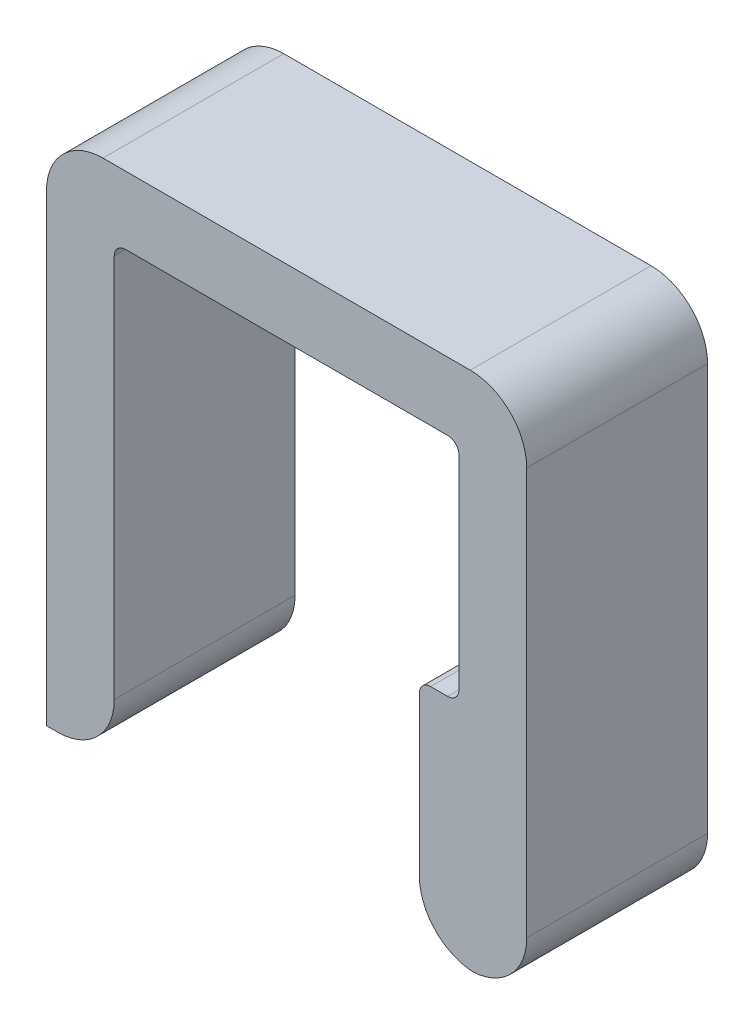
ISO-10303-21;
HEADER;
FILE_DESCRIPTION(('STEP AP214'),'2;1');
FILE_NAME('part.step','',(''),(''),'','','');
FILE_SCHEMA(('AUTOMOTIVE_DESIGN { 1 0 10303 214 1 1 1 1 }'));
ENDSEC;
DATA;
#1=APPLICATION_CONTEXT('core data for automotive mechanical design processes');
#2=APPLICATION_PROTOCOL_DEFINITION('international standard','automotive_design',2000,#1);
#3=PRODUCT_CONTEXT('',#1,'mechanical');
#4=PRODUCT('Part','Part','',(#3));
#5=PRODUCT_RELATED_PRODUCT_CATEGORY('part','',(#4));
#6=PRODUCT_DEFINITION_FORMATION('','',#4);
#7=PRODUCT_DEFINITION_CONTEXT('part definition',#1,'design');
#8=PRODUCT_DEFINITION('design','',#6,#7);
#9=PRODUCT_DEFINITION_SHAPE('','',#8);
#10=(LENGTH_UNIT() NAMED_UNIT(*) SI_UNIT(.MILLI.,.METRE.));
#11=(NAMED_UNIT(*) PLANE_ANGLE_UNIT() SI_UNIT($,.RADIAN.));
#12=(NAMED_UNIT(*) SI_UNIT($,.STERADIAN.) SOLID_ANGLE_UNIT());
#13=UNCERTAINTY_MEASURE_WITH_UNIT(LENGTH_MEASURE(1.E-05),#10,'distance_accuracy_value','');
#14=(GEOMETRIC_REPRESENTATION_CONTEXT(3) GLOBAL_UNCERTAINTY_ASSIGNED_CONTEXT((#13)) GLOBAL_UNIT_ASSIGNED_CONTEXT((#10,
#11,#12)) REPRESENTATION_CONTEXT('',''));
#15=CARTESIAN_POINT('',(0.,0.,0.));
#16=DIRECTION('',(0.,0.,1.));
#17=DIRECTION('',(1.,0.,0.));
#18=AXIS2_PLACEMENT_3D('',#15,#16,#17);
#19=CARTESIAN_POINT('',(-15.25,20.,16.));
#20=DIRECTION('',(-1.,0.,0.));
#21=DIRECTION('',(0.,-1.,0.));
#22=AXIS2_PLACEMENT_3D('',#19,#20,#21);
#23=PLANE('',#22);
#24=DIRECTION('',(0.,1.,0.));
#25=VECTOR('',#24,1.);
#26=CARTESIAN_POINT('',(-15.25,20.,0.));
#27=LINE('',#26,#25);
#28=CARTESIAN_POINT('',(-15.25,-15.,0.));
#29=VERTEX_POINT('',#28);
#30=CARTESIAN_POINT('',(-15.25,19.,0.));
#31=VERTEX_POINT('',#30);
#32=EDGE_CURVE('E188',#29,#31,#27,.T.);
#33=ORIENTED_EDGE('',*,*,#32,.T.);
#34=DIRECTION('',(0.,0.,-1.));
#35=VECTOR('',#34,1.);
#36=CARTESIAN_POINT('',(-15.25,19.,16.));
#37=LINE('',#36,#35);
#38=CARTESIAN_POINT('',(-15.25,19.,16.));
#39=VERTEX_POINT('',#38);
#40=EDGE_CURVE('E273',#31,#39,#37,.F.);
#41=ORIENTED_EDGE('',*,*,#40,.T.);
#42=DIRECTION('',(0.,1.,0.));
#43=VECTOR('',#42,1.);
#44=CARTESIAN_POINT('',(-15.25,20.,16.));
#45=LINE('',#44,#43);
#46=CARTESIAN_POINT('',(-15.25,-15.,16.));
#47=VERTEX_POINT('',#46);
#48=EDGE_CURVE('E210',#47,#39,#45,.T.);
#49=ORIENTED_EDGE('',*,*,#48,.F.);
#50=DIRECTION('',(0.,0.,-1.));
#51=VECTOR('',#50,1.);
#52=CARTESIAN_POINT('',(-15.25,-15.,16.));
#53=LINE('',#52,#51);
#54=EDGE_CURVE('E239',#47,#29,#53,.T.);
#55=ORIENTED_EDGE('',*,*,#54,.T.);
#56=EDGE_LOOP('',(#33,#41,#49,#55));
#57=FACE_BOUND('',#56,.T.);
#58=ADVANCED_FACE('F33',(#57),#23,.F.);
#59=CARTESIAN_POINT('',(15.25,20.,16.));
#60=DIRECTION('',(0.,1.,0.));
#61=DIRECTION('',(0.,0.,1.));
#62=AXIS2_PLACEMENT_3D('',#59,#60,#61);
#63=PLANE('',#62);
#64=DIRECTION('',(1.,0.,0.));
#65=VECTOR('',#64,1.);
#66=CARTESIAN_POINT('',(15.25,20.,0.));
#67=LINE('',#66,#65);
#68=CARTESIAN_POINT('',(-14.25,20.,0.));
#69=VERTEX_POINT('',#68);
#70=CARTESIAN_POINT('',(14.25,20.,0.));
#71=VERTEX_POINT('',#70);
#72=EDGE_CURVE('E191',#69,#71,#67,.T.);
#73=ORIENTED_EDGE('',*,*,#72,.T.);
#74=DIRECTION('',(0.,0.,-1.));
#75=VECTOR('',#74,1.);
#76=CARTESIAN_POINT('',(14.25,20.,16.));
#77=LINE('',#76,#75);
#78=CARTESIAN_POINT('',(14.25,20.,16.));
#79=VERTEX_POINT('',#78);
#80=EDGE_CURVE('E48',#71,#79,#77,.F.);
#81=ORIENTED_EDGE('',*,*,#80,.T.);
#82=DIRECTION('',(1.,0.,0.));
#83=VECTOR('',#82,1.);
#84=CARTESIAN_POINT('',(15.25,20.,16.));
#85=LINE('',#84,#83);
#86=CARTESIAN_POINT('',(-14.25,20.,16.));
#87=VERTEX_POINT('',#86);
#88=EDGE_CURVE('E294',#87,#79,#85,.T.);
#89=ORIENTED_EDGE('',*,*,#88,.F.);
#90=DIRECTION('',(0.,0.,-1.));
#91=VECTOR('',#90,1.);
#92=CARTESIAN_POINT('',(-14.25,20.,0.));
#93=LINE('',#92,#91);
#94=EDGE_CURVE('E269',#87,#69,#93,.T.);
#95=ORIENTED_EDGE('',*,*,#94,.T.);
#96=EDGE_LOOP('',(#73,#81,#89,#95));
#97=FACE_BOUND('',#96,.T.);
#98=ADVANCED_FACE('F293',(#97),#63,.F.);
#99=CARTESIAN_POINT('',(15.25,0.,16.));
#100=DIRECTION('',(1.,0.,0.));
#101=DIRECTION('',(0.,1.,0.));
#102=AXIS2_PLACEMENT_3D('',#99,#100,#101);
#103=PLANE('',#102);
#104=DIRECTION('',(0.,-1.,0.));
#105=VECTOR('',#104,1.);
#106=CARTESIAN_POINT('',(15.25,0.,0.));
#107=LINE('',#106,#105);
#108=CARTESIAN_POINT('',(15.25,19.,0.));
#109=VERTEX_POINT('',#108);
#110=CARTESIAN_POINT('',(15.25,1.,0.));
#111=VERTEX_POINT('',#110);
#112=EDGE_CURVE('E194',#109,#111,#107,.T.);
#113=ORIENTED_EDGE('',*,*,#112,.T.);
#114=DIRECTION('',(0.,0.,-1.));
#115=VECTOR('',#114,1.);
#116=CARTESIAN_POINT('',(15.25,1.,16.));
#117=LINE('',#116,#115);
#118=CARTESIAN_POINT('',(15.25,1.,16.));
#119=VERTEX_POINT('',#118);
#120=EDGE_CURVE('E260',#111,#119,#117,.F.);
#121=ORIENTED_EDGE('',*,*,#120,.T.);
#122=DIRECTION('',(0.,-1.,0.));
#123=VECTOR('',#122,1.);
#124=CARTESIAN_POINT('',(15.25,0.,16.));
#125=LINE('',#124,#123);
#126=CARTESIAN_POINT('',(15.25,19.,16.));
#127=VERTEX_POINT('',#126);
#128=EDGE_CURVE('E296',#127,#119,#125,.T.);
#129=ORIENTED_EDGE('',*,*,#128,.F.);
#130=DIRECTION('',(0.,0.,-1.));
#131=VECTOR('',#130,1.);
#132=CARTESIAN_POINT('',(15.25,19.,0.));
#133=LINE('',#132,#131);
#134=EDGE_CURVE('E257',#127,#109,#133,.T.);
#135=ORIENTED_EDGE('',*,*,#134,.T.);
#136=EDGE_LOOP('',(#113,#121,#129,#135));
#137=FACE_BOUND('',#136,.T.);
#138=ADVANCED_FACE('F337',(#137),#103,.F.);
#139=CARTESIAN_POINT('',(15.25,0.,16.));
#140=DIRECTION('',(0.,-1.,0.));
#141=DIRECTION('',(1.,0.,0.));
#142=AXIS2_PLACEMENT_3D('',#139,#140,#141);
#143=PLANE('',#142);
#144=DIRECTION('',(-1.,0.,0.));
#145=VECTOR('',#144,1.);
#146=CARTESIAN_POINT('',(15.25,0.,16.));
#147=LINE('',#146,#145);
#148=CARTESIAN_POINT('',(14.25,0.,16.));
#149=VERTEX_POINT('',#148);
#150=CARTESIAN_POINT('',(12.75,0.,16.));
#151=VERTEX_POINT('',#150);
#152=EDGE_CURVE('E299',#149,#151,#147,.T.);
#153=ORIENTED_EDGE('',*,*,#152,.F.);
#154=DIRECTION('',(0.,0.,-1.));
#155=VECTOR('',#154,1.);
#156=CARTESIAN_POINT('',(14.25,0.,0.));
#157=LINE('',#156,#155);
#158=CARTESIAN_POINT('',(14.25,0.,0.));
#159=VERTEX_POINT('',#158);
#160=EDGE_CURVE('E254',#149,#159,#157,.T.);
#161=ORIENTED_EDGE('',*,*,#160,.T.);
#162=DIRECTION('',(-1.,0.,0.));
#163=VECTOR('',#162,1.);
#164=CARTESIAN_POINT('',(15.25,0.,0.));
#165=LINE('',#164,#163);
#166=CARTESIAN_POINT('',(12.75,0.,0.));
#167=VERTEX_POINT('',#166);
#168=EDGE_CURVE('E197',#159,#167,#165,.T.);
#169=ORIENTED_EDGE('',*,*,#168,.T.);
#170=DIRECTION('',(0.,0.,-1.));
#171=VECTOR('',#170,1.);
#172=CARTESIAN_POINT('',(12.75,0.,16.));
#173=LINE('',#172,#171);
#174=EDGE_CURVE('E250',#167,#151,#173,.F.);
#175=ORIENTED_EDGE('',*,*,#174,.T.);
#176=EDGE_LOOP('',(#153,#161,#169,#175));
#177=FACE_BOUND('',#176,.T.);
#178=ADVANCED_FACE('F369',(#177),#143,.F.);
#179=CARTESIAN_POINT('',(11.75,0.,16.));
#180=DIRECTION('',(1.,0.,0.));
#181=DIRECTION('',(0.,1.,0.));
#182=AXIS2_PLACEMENT_3D('',#179,#180,#181);
#183=PLANE('',#182);
#184=DIRECTION('',(0.,-1.,0.));
#185=VECTOR('',#184,1.);
#186=CARTESIAN_POINT('',(11.75,0.,16.));
#187=LINE('',#186,#185);
#188=CARTESIAN_POINT('',(11.75,-0.999999999999997,16.));
#189=VERTEX_POINT('',#188);
#190=CARTESIAN_POINT('',(11.75,-15.,16.));
#191=VERTEX_POINT('',#190);
#192=EDGE_CURVE('E304',#189,#191,#187,.T.);
#193=ORIENTED_EDGE('',*,*,#192,.F.);
#194=DIRECTION('',(0.,0.,-1.));
#195=VECTOR('',#194,1.);
#196=CARTESIAN_POINT('',(11.75,-0.999999999999997,16.));
#197=LINE('',#196,#195);
#198=CARTESIAN_POINT('',(11.75,-0.999999999999997,0.));
#199=VERTEX_POINT('',#198);
#200=EDGE_CURVE('E262',#189,#199,#197,.T.);
#201=ORIENTED_EDGE('',*,*,#200,.T.);
#202=DIRECTION('',(0.,-1.,0.));
#203=VECTOR('',#202,1.);
#204=CARTESIAN_POINT('',(11.75,0.,0.));
#205=LINE('',#204,#203);
#206=CARTESIAN_POINT('',(11.75,-15.,0.));
#207=VERTEX_POINT('',#206);
#208=EDGE_CURVE('E200',#199,#207,#205,.T.);
#209=ORIENTED_EDGE('',*,*,#208,.T.);
#210=DIRECTION('',(0.,0.,-1.));
#211=VECTOR('',#210,1.);
#212=CARTESIAN_POINT('',(11.75,-15.,16.));
#213=LINE('',#212,#211);
#214=EDGE_CURVE('E236',#207,#191,#213,.F.);
#215=ORIENTED_EDGE('',*,*,#214,.T.);
#216=EDGE_LOOP('',(#193,#201,#209,#215));
#217=FACE_BOUND('',#216,.T.);
#218=ADVANCED_FACE('F360',(#217),#183,.F.);
#219=CARTESIAN_POINT('',(21.25,-20.,16.));
#220=DIRECTION('',(-1.,0.,0.));
#221=DIRECTION('',(0.,0.,1.));
#222=AXIS2_PLACEMENT_3D('',#219,#220,#221);
#223=PLANE('',#222);
#224=DIRECTION('',(0.,1.,0.));
#225=VECTOR('',#224,1.);
#226=CARTESIAN_POINT('',(21.25,-20.,16.));
#227=LINE('',#226,#225);
#228=CARTESIAN_POINT('',(21.25,-15.,16.));
#229=VERTEX_POINT('',#228);
#230=CARTESIAN_POINT('',(21.25,21.,16.));
#231=VERTEX_POINT('',#230);
#232=EDGE_CURVE('E306',#229,#231,#227,.T.);
#233=ORIENTED_EDGE('',*,*,#232,.F.);
#234=DIRECTION('',(0.,0.,-1.));
#235=VECTOR('',#234,1.);
#236=CARTESIAN_POINT('',(21.25,-15.,16.));
#237=LINE('',#236,#235);
#238=CARTESIAN_POINT('',(21.25,-15.,0.));
#239=VERTEX_POINT('',#238);
#240=EDGE_CURVE('E213',#229,#239,#237,.T.);
#241=ORIENTED_EDGE('',*,*,#240,.T.);
#242=DIRECTION('',(0.,1.,0.));
#243=VECTOR('',#242,1.);
#244=CARTESIAN_POINT('',(21.25,-20.,0.));
#245=LINE('',#244,#243);
#246=CARTESIAN_POINT('',(21.25,21.,0.));
#247=VERTEX_POINT('',#246);
#248=EDGE_CURVE('E202',#239,#247,#245,.T.);
#249=ORIENTED_EDGE('',*,*,#248,.T.);
#250=DIRECTION('',(0.,0.,-1.));
#251=VECTOR('',#250,1.);
#252=CARTESIAN_POINT('',(21.25,21.,16.));
#253=LINE('',#252,#251);
#254=EDGE_CURVE('E180',#247,#231,#253,.F.);
#255=ORIENTED_EDGE('',*,*,#254,.T.);
#256=EDGE_LOOP('',(#233,#241,#249,#255));
#257=FACE_BOUND('',#256,.T.);
#258=ADVANCED_FACE('F354',(#257),#223,.F.);
#259=CARTESIAN_POINT('',(21.25,26.,16.));
#260=DIRECTION('',(0.,-1.,0.));
#261=DIRECTION('',(1.,0.,0.));
#262=AXIS2_PLACEMENT_3D('',#259,#260,#261);
#263=PLANE('',#262);
#264=DIRECTION('',(-1.,0.,0.));
#265=VECTOR('',#264,1.);
#266=CARTESIAN_POINT('',(21.25,26.,16.));
#267=LINE('',#266,#265);
#268=CARTESIAN_POINT('',(16.25,26.,16.));
#269=VERTEX_POINT('',#268);
#270=CARTESIAN_POINT('',(-16.25,26.,16.));
#271=VERTEX_POINT('',#270);
#272=EDGE_CURVE('E170',#269,#271,#267,.T.);
#273=ORIENTED_EDGE('',*,*,#272,.F.);
#274=DIRECTION('',(0.,0.,-1.));
#275=VECTOR('',#274,1.);
#276=CARTESIAN_POINT('',(16.25,26.,16.));
#277=LINE('',#276,#275);
#278=CARTESIAN_POINT('',(16.25,26.,0.));
#279=VERTEX_POINT('',#278);
#280=EDGE_CURVE('E245',#269,#279,#277,.T.);
#281=ORIENTED_EDGE('',*,*,#280,.T.);
#282=DIRECTION('',(-1.,0.,0.));
#283=VECTOR('',#282,1.);
#284=CARTESIAN_POINT('',(21.25,26.,0.));
#285=LINE('',#284,#283);
#286=CARTESIAN_POINT('',(-16.25,26.,0.));
#287=VERTEX_POINT('',#286);
#288=EDGE_CURVE('E205',#279,#287,#285,.T.);
#289=ORIENTED_EDGE('',*,*,#288,.T.);
#290=DIRECTION('',(0.,0.,-1.));
#291=VECTOR('',#290,1.);
#292=CARTESIAN_POINT('',(-16.25,26.,16.));
#293=LINE('',#292,#291);
#294=EDGE_CURVE('E243',#287,#271,#293,.F.);
#295=ORIENTED_EDGE('',*,*,#294,.T.);
#296=EDGE_LOOP('',(#273,#281,#289,#295));
#297=FACE_BOUND('',#296,.T.);
#298=ADVANCED_FACE('F357',(#297),#263,.F.);
#299=CARTESIAN_POINT('',(-21.25,26.,16.));
#300=DIRECTION('',(1.,0.,0.));
#301=DIRECTION('',(0.,1.,0.));
#302=AXIS2_PLACEMENT_3D('',#299,#300,#301);
#303=PLANE('',#302);
#304=DIRECTION('',(0.,-1.,0.));
#305=VECTOR('',#304,1.);
#306=CARTESIAN_POINT('',(-21.25,26.,16.));
#307=LINE('',#306,#305);
#308=CARTESIAN_POINT('',(-21.25,21.,16.));
#309=VERTEX_POINT('',#308);
#310=CARTESIAN_POINT('',(-21.25,-20.,16.));
#311=VERTEX_POINT('',#310);
#312=EDGE_CURVE('E157',#309,#311,#307,.T.);
#313=ORIENTED_EDGE('',*,*,#312,.F.);
#314=DIRECTION('',(0.,0.,-1.));
#315=VECTOR('',#314,1.);
#316=CARTESIAN_POINT('',(-21.25,21.,16.));
#317=LINE('',#316,#315);
#318=CARTESIAN_POINT('',(-21.25,21.,0.));
#319=VERTEX_POINT('',#318);
#320=EDGE_CURVE('E248',#309,#319,#317,.T.);
#321=ORIENTED_EDGE('',*,*,#320,.T.);
#322=DIRECTION('',(0.,-1.,0.));
#323=VECTOR('',#322,1.);
#324=CARTESIAN_POINT('',(-21.25,26.,0.));
#325=LINE('',#324,#323);
#326=CARTESIAN_POINT('',(-21.25,-20.,0.));
#327=VERTEX_POINT('',#326);
#328=EDGE_CURVE('E176',#319,#327,#325,.T.);
#329=ORIENTED_EDGE('',*,*,#328,.T.);
#330=DIRECTION('',(0.,0.,-1.));
#331=VECTOR('',#330,1.);
#332=CARTESIAN_POINT('',(-21.25,-20.,16.));
#333=LINE('',#332,#331);
#334=EDGE_CURVE('E173',#311,#327,#333,.T.);
#335=ORIENTED_EDGE('',*,*,#334,.F.);
#336=EDGE_LOOP('',(#313,#321,#329,#335));
#337=FACE_BOUND('',#336,.T.);
#338=ADVANCED_FACE('F174',(#337),#303,.F.);
#339=CARTESIAN_POINT('',(-21.25,-20.,16.));
#340=DIRECTION('',(0.,1.,0.));
#341=DIRECTION('',(0.,0.,1.));
#342=AXIS2_PLACEMENT_3D('',#339,#340,#341);
#343=PLANE('',#342);
#344=DIRECTION('',(1.,0.,0.));
#345=VECTOR('',#344,1.);
#346=CARTESIAN_POINT('',(-21.25,-20.,0.));
#347=LINE('',#346,#345);
#348=CARTESIAN_POINT('',(-20.25,-20.,0.));
#349=VERTEX_POINT('',#348);
#350=EDGE_CURVE('E209',#327,#349,#347,.T.);
#351=ORIENTED_EDGE('',*,*,#350,.T.);
#352=DIRECTION('',(0.,0.,-1.));
#353=VECTOR('',#352,1.);
#354=CARTESIAN_POINT('',(-20.25,-20.,16.));
#355=LINE('',#354,#353);
#356=CARTESIAN_POINT('',(-20.25,-20.,16.));
#357=VERTEX_POINT('',#356);
#358=EDGE_CURVE('E184',#349,#357,#355,.F.);
#359=ORIENTED_EDGE('',*,*,#358,.T.);
#360=DIRECTION('',(1.,0.,0.));
#361=VECTOR('',#360,1.);
#362=CARTESIAN_POINT('',(-21.25,-20.,16.));
#363=LINE('',#362,#361);
#364=EDGE_CURVE('E162',#311,#357,#363,.T.);
#365=ORIENTED_EDGE('',*,*,#364,.F.);
#366=ORIENTED_EDGE('',*,*,#334,.T.);
#367=EDGE_LOOP('',(#351,#359,#365,#366));
#368=FACE_BOUND('',#367,.T.);
#369=ADVANCED_FACE('F182',(#368),#343,.F.);
#370=CARTESIAN_POINT('',(0.,0.,16.));
#371=DIRECTION('',(0.,0.,1.));
#372=DIRECTION('',(1.,0.,0.));
#373=AXIS2_PLACEMENT_3D('',#370,#371,#372);
#374=PLANE('',#373);
#375=ORIENTED_EDGE('',*,*,#152,.T.);
#376=CARTESIAN_POINT('',(12.75,-0.999999999999997,16.));
#377=DIRECTION('',(0.,0.,1.));
#378=DIRECTION('',(1.,0.,0.));
#379=AXIS2_PLACEMENT_3D('',#376,#377,#378);
#380=CIRCLE('',#379,1.);
#381=EDGE_CURVE('E267',#151,#189,#380,.T.);
#382=ORIENTED_EDGE('',*,*,#381,.T.);
#383=ORIENTED_EDGE('',*,*,#192,.T.);
#384=CARTESIAN_POINT('',(16.75,-15.,16.));
#385=DIRECTION('',(0.,0.,1.));
#386=DIRECTION('',(1.,0.,0.));
#387=AXIS2_PLACEMENT_3D('',#384,#385,#386);
#388=CIRCLE('',#387,5.);
#389=CARTESIAN_POINT('',(16.5,-19.9937460888595,16.));
#390=VERTEX_POINT('',#389);
#391=EDGE_CURVE('E232',#191,#390,#388,.T.);
#392=ORIENTED_EDGE('',*,*,#391,.T.);
#393=CARTESIAN_POINT('',(16.25,-15.,16.));
#394=DIRECTION('',(0.,0.,1.));
#395=DIRECTION('',(1.,0.,0.));
#396=AXIS2_PLACEMENT_3D('',#393,#394,#395);
#397=CIRCLE('',#396,5.);
#398=EDGE_CURVE('E234',#390,#229,#397,.T.);
#399=ORIENTED_EDGE('',*,*,#398,.T.);
#400=ORIENTED_EDGE('',*,*,#232,.T.);
#401=CARTESIAN_POINT('',(16.25,21.,16.));
#402=DIRECTION('',(0.,0.,1.));
#403=DIRECTION('',(1.,0.,0.));
#404=AXIS2_PLACEMENT_3D('',#401,#402,#403);
#405=CIRCLE('',#404,5.);
#406=EDGE_CURVE('E228',#231,#269,#405,.T.);
#407=ORIENTED_EDGE('',*,*,#406,.T.);
#408=ORIENTED_EDGE('',*,*,#272,.T.);
#409=CARTESIAN_POINT('',(-16.25,21.,16.));
#410=DIRECTION('',(0.,0.,1.));
#411=DIRECTION('',(1.,0.,0.));
#412=AXIS2_PLACEMENT_3D('',#409,#410,#411);
#413=CIRCLE('',#412,5.);
#414=EDGE_CURVE('E166',#271,#309,#413,.T.);
#415=ORIENTED_EDGE('',*,*,#414,.T.);
#416=ORIENTED_EDGE('',*,*,#312,.T.);
#417=ORIENTED_EDGE('',*,*,#364,.T.);
#418=CARTESIAN_POINT('',(-20.25,-15.,16.));
#419=DIRECTION('',(0.,0.,1.));
#420=DIRECTION('',(1.,0.,0.));
#421=AXIS2_PLACEMENT_3D('',#418,#419,#420);
#422=CIRCLE('',#421,5.);
#423=EDGE_CURVE('E230',#357,#47,#422,.T.);
#424=ORIENTED_EDGE('',*,*,#423,.T.);
#425=ORIENTED_EDGE('',*,*,#48,.T.);
#426=CARTESIAN_POINT('',(-14.25,19.,16.));
#427=DIRECTION('',(0.,0.,1.));
#428=DIRECTION('',(1.,0.,0.));
#429=AXIS2_PLACEMENT_3D('',#426,#427,#428);
#430=CIRCLE('',#429,1.);
#431=EDGE_CURVE('E11',#39,#87,#430,.F.);
#432=ORIENTED_EDGE('',*,*,#431,.T.);
#433=ORIENTED_EDGE('',*,*,#88,.T.);
#434=CARTESIAN_POINT('',(14.25,19.,16.));
#435=DIRECTION('',(0.,0.,1.));
#436=DIRECTION('',(1.,0.,0.));
#437=AXIS2_PLACEMENT_3D('',#434,#435,#436);
#438=CIRCLE('',#437,1.);
#439=EDGE_CURVE('E281',#79,#127,#438,.F.);
#440=ORIENTED_EDGE('',*,*,#439,.T.);
#441=ORIENTED_EDGE('',*,*,#128,.T.);
#442=CARTESIAN_POINT('',(14.25,1.,16.));
#443=DIRECTION('',(0.,0.,1.));
#444=DIRECTION('',(1.,0.,0.));
#445=AXIS2_PLACEMENT_3D('',#442,#443,#444);
#446=CIRCLE('',#445,1.);
#447=EDGE_CURVE('E277',#119,#149,#446,.F.);
#448=ORIENTED_EDGE('',*,*,#447,.T.);
#449=EDGE_LOOP('',(#375,#382,#383,#392,#399,#400,#407,#408,#415,#416,#417,#424,#425,#432,#433,
#440,#441,#448));
#450=FACE_BOUND('',#449,.T.);
#451=ADVANCED_FACE('F160',(#450),#374,.T.);
#452=CARTESIAN_POINT('',(0.,0.,0.));
#453=DIRECTION('',(0.,0.,1.));
#454=DIRECTION('',(1.,0.,0.));
#455=AXIS2_PLACEMENT_3D('',#452,#453,#454);
#456=PLANE('',#455);
#457=ORIENTED_EDGE('',*,*,#208,.F.);
#458=CARTESIAN_POINT('',(12.75,-0.999999999999997,0.));
#459=DIRECTION('',(0.,0.,1.));
#460=DIRECTION('',(1.,0.,0.));
#461=AXIS2_PLACEMENT_3D('',#458,#459,#460);
#462=CIRCLE('',#461,1.);
#463=EDGE_CURVE('E265',#199,#167,#462,.F.);
#464=ORIENTED_EDGE('',*,*,#463,.T.);
#465=ORIENTED_EDGE('',*,*,#168,.F.);
#466=CARTESIAN_POINT('',(14.25,1.,0.));
#467=DIRECTION('',(0.,0.,1.));
#468=DIRECTION('',(1.,0.,0.));
#469=AXIS2_PLACEMENT_3D('',#466,#467,#468);
#470=CIRCLE('',#469,1.);
#471=EDGE_CURVE('E275',#159,#111,#470,.T.);
#472=ORIENTED_EDGE('',*,*,#471,.T.);
#473=ORIENTED_EDGE('',*,*,#112,.F.);
#474=CARTESIAN_POINT('',(14.25,19.,0.));
#475=DIRECTION('',(0.,0.,1.));
#476=DIRECTION('',(1.,0.,0.));
#477=AXIS2_PLACEMENT_3D('',#474,#475,#476);
#478=CIRCLE('',#477,1.);
#479=EDGE_CURVE('E279',#109,#71,#478,.T.);
#480=ORIENTED_EDGE('',*,*,#479,.T.);
#481=ORIENTED_EDGE('',*,*,#72,.F.);
#482=CARTESIAN_POINT('',(-14.25,19.,0.));
#483=DIRECTION('',(0.,0.,1.));
#484=DIRECTION('',(1.,0.,0.));
#485=AXIS2_PLACEMENT_3D('',#482,#483,#484);
#486=CIRCLE('',#485,1.);
#487=EDGE_CURVE('E41',#69,#31,#486,.T.);
#488=ORIENTED_EDGE('',*,*,#487,.T.);
#489=ORIENTED_EDGE('',*,*,#32,.F.);
#490=CARTESIAN_POINT('',(-20.25,-15.,0.));
#491=DIRECTION('',(0.,0.,1.));
#492=DIRECTION('',(1.,0.,0.));
#493=AXIS2_PLACEMENT_3D('',#490,#491,#492);
#494=CIRCLE('',#493,5.);
#495=EDGE_CURVE('E220',#29,#349,#494,.F.);
#496=ORIENTED_EDGE('',*,*,#495,.T.);
#497=ORIENTED_EDGE('',*,*,#350,.F.);
#498=ORIENTED_EDGE('',*,*,#328,.F.);
#499=CARTESIAN_POINT('',(-16.25,21.,0.));
#500=DIRECTION('',(0.,0.,1.));
#501=DIRECTION('',(1.,0.,0.));
#502=AXIS2_PLACEMENT_3D('',#499,#500,#501);
#503=CIRCLE('',#502,5.);
#504=EDGE_CURVE('E216',#319,#287,#503,.F.);
#505=ORIENTED_EDGE('',*,*,#504,.T.);
#506=ORIENTED_EDGE('',*,*,#288,.F.);
#507=CARTESIAN_POINT('',(16.25,21.,0.));
#508=DIRECTION('',(0.,0.,1.));
#509=DIRECTION('',(1.,0.,0.));
#510=AXIS2_PLACEMENT_3D('',#507,#508,#509);
#511=CIRCLE('',#510,5.);
#512=EDGE_CURVE('E218',#279,#247,#511,.F.);
#513=ORIENTED_EDGE('',*,*,#512,.T.);
#514=ORIENTED_EDGE('',*,*,#248,.F.);
#515=CARTESIAN_POINT('',(16.25,-15.,0.));
#516=DIRECTION('',(0.,0.,1.));
#517=DIRECTION('',(1.,0.,0.));
#518=AXIS2_PLACEMENT_3D('',#515,#516,#517);
#519=CIRCLE('',#518,5.);
#520=CARTESIAN_POINT('',(16.5,-19.9937460888595,0.));
#521=VERTEX_POINT('',#520);
#522=EDGE_CURVE('E225',#239,#521,#519,.F.);
#523=ORIENTED_EDGE('',*,*,#522,.T.);
#524=CARTESIAN_POINT('',(16.75,-15.,0.));
#525=DIRECTION('',(0.,0.,1.));
#526=DIRECTION('',(1.,0.,0.));
#527=AXIS2_PLACEMENT_3D('',#524,#525,#526);
#528=CIRCLE('',#527,5.);
#529=EDGE_CURVE('E222',#521,#207,#528,.F.);
#530=ORIENTED_EDGE('',*,*,#529,.T.);
#531=EDGE_LOOP('',(#457,#464,#465,#472,#473,#480,#481,#488,#489,#496,#497,#498,#505,#506,#513,
#514,#523,#530));
#532=FACE_BOUND('',#531,.T.);
#533=ADVANCED_FACE('F286',(#532),#456,.F.);
#534=CARTESIAN_POINT('',(16.75,-15.,16.));
#535=DIRECTION('',(0.,0.,-1.));
#536=DIRECTION('',(-1.,0.,0.));
#537=AXIS2_PLACEMENT_3D('',#534,#535,#536);
#538=CYLINDRICAL_SURFACE('',#537,5.);
#539=DIRECTION('',(0.,0.,-1.));
#540=VECTOR('',#539,1.);
#541=CARTESIAN_POINT('',(16.5,-19.9937460888595,8.));
#542=LINE('',#541,#540);
#543=EDGE_CURVE('E192',#390,#521,#542,.T.);
#544=ORIENTED_EDGE('',*,*,#543,.F.);
#545=ORIENTED_EDGE('',*,*,#391,.F.);
#546=ORIENTED_EDGE('',*,*,#214,.F.);
#547=ORIENTED_EDGE('',*,*,#529,.F.);
#548=EDGE_LOOP('',(#544,#545,#546,#547));
#549=FACE_BOUND('',#548,.T.);
#550=ADVANCED_FACE('F328',(#549),#538,.T.);
#551=CARTESIAN_POINT('',(16.25,-15.,16.));
#552=DIRECTION('',(0.,0.,-1.));
#553=DIRECTION('',(-1.,0.,0.));
#554=AXIS2_PLACEMENT_3D('',#551,#552,#553);
#555=CYLINDRICAL_SURFACE('',#554,5.);
#556=ORIENTED_EDGE('',*,*,#398,.F.);
#557=ORIENTED_EDGE('',*,*,#543,.T.);
#558=ORIENTED_EDGE('',*,*,#522,.F.);
#559=ORIENTED_EDGE('',*,*,#240,.F.);
#560=EDGE_LOOP('',(#556,#557,#558,#559));
#561=FACE_BOUND('',#560,.T.);
#562=ADVANCED_FACE('F320',(#561),#555,.T.);
#563=CARTESIAN_POINT('',(-20.25,-15.,16.));
#564=DIRECTION('',(0.,0.,-1.));
#565=DIRECTION('',(-1.,0.,0.));
#566=AXIS2_PLACEMENT_3D('',#563,#564,#565);
#567=CYLINDRICAL_SURFACE('',#566,5.);
#568=ORIENTED_EDGE('',*,*,#423,.F.);
#569=ORIENTED_EDGE('',*,*,#358,.F.);
#570=ORIENTED_EDGE('',*,*,#495,.F.);
#571=ORIENTED_EDGE('',*,*,#54,.F.);
#572=EDGE_LOOP('',(#568,#569,#570,#571));
#573=FACE_BOUND('',#572,.T.);
#574=ADVANCED_FACE('F317',(#573),#567,.T.);
#575=CARTESIAN_POINT('',(16.25,21.,16.));
#576=DIRECTION('',(0.,0.,-1.));
#577=DIRECTION('',(-1.,0.,0.));
#578=AXIS2_PLACEMENT_3D('',#575,#576,#577);
#579=CYLINDRICAL_SURFACE('',#578,5.);
#580=ORIENTED_EDGE('',*,*,#406,.F.);
#581=ORIENTED_EDGE('',*,*,#254,.F.);
#582=ORIENTED_EDGE('',*,*,#512,.F.);
#583=ORIENTED_EDGE('',*,*,#280,.F.);
#584=EDGE_LOOP('',(#580,#581,#582,#583));
#585=FACE_BOUND('',#584,.T.);
#586=ADVANCED_FACE('F319',(#585),#579,.T.);
#587=CARTESIAN_POINT('',(-16.25,21.,16.));
#588=DIRECTION('',(0.,0.,-1.));
#589=DIRECTION('',(-1.,0.,0.));
#590=AXIS2_PLACEMENT_3D('',#587,#588,#589);
#591=CYLINDRICAL_SURFACE('',#590,5.);
#592=ORIENTED_EDGE('',*,*,#414,.F.);
#593=ORIENTED_EDGE('',*,*,#294,.F.);
#594=ORIENTED_EDGE('',*,*,#504,.F.);
#595=ORIENTED_EDGE('',*,*,#320,.F.);
#596=EDGE_LOOP('',(#592,#593,#594,#595));
#597=FACE_BOUND('',#596,.T.);
#598=ADVANCED_FACE('F314',(#597),#591,.T.);
#599=CARTESIAN_POINT('',(14.25,1.,16.));
#600=DIRECTION('',(0.,0.,1.));
#601=DIRECTION('',(1.,0.,0.));
#602=AXIS2_PLACEMENT_3D('',#599,#600,#601);
#603=CYLINDRICAL_SURFACE('',#602,1.);
#604=ORIENTED_EDGE('',*,*,#447,.F.);
#605=ORIENTED_EDGE('',*,*,#120,.F.);
#606=ORIENTED_EDGE('',*,*,#471,.F.);
#607=ORIENTED_EDGE('',*,*,#160,.F.);
#608=EDGE_LOOP('',(#604,#605,#606,#607));
#609=FACE_BOUND('',#608,.T.);
#610=ADVANCED_FACE('F373',(#609),#603,.F.);
#611=CARTESIAN_POINT('',(12.75,-0.999999999999997,16.));
#612=DIRECTION('',(0.,0.,-1.));
#613=DIRECTION('',(-1.,0.,0.));
#614=AXIS2_PLACEMENT_3D('',#611,#612,#613);
#615=CYLINDRICAL_SURFACE('',#614,1.);
#616=ORIENTED_EDGE('',*,*,#381,.F.);
#617=ORIENTED_EDGE('',*,*,#174,.F.);
#618=ORIENTED_EDGE('',*,*,#463,.F.);
#619=ORIENTED_EDGE('',*,*,#200,.F.);
#620=EDGE_LOOP('',(#616,#617,#618,#619));
#621=FACE_BOUND('',#620,.T.);
#622=ADVANCED_FACE('F364',(#621),#615,.T.);
#623=CARTESIAN_POINT('',(14.25,19.,16.));
#624=DIRECTION('',(0.,0.,1.));
#625=DIRECTION('',(1.,0.,0.));
#626=AXIS2_PLACEMENT_3D('',#623,#624,#625);
#627=CYLINDRICAL_SURFACE('',#626,1.);
#628=ORIENTED_EDGE('',*,*,#439,.F.);
#629=ORIENTED_EDGE('',*,*,#80,.F.);
#630=ORIENTED_EDGE('',*,*,#479,.F.);
#631=ORIENTED_EDGE('',*,*,#134,.F.);
#632=EDGE_LOOP('',(#628,#629,#630,#631));
#633=FACE_BOUND('',#632,.T.);
#634=ADVANCED_FACE('F380',(#633),#627,.F.);
#635=CARTESIAN_POINT('',(-14.25,19.,16.));
#636=DIRECTION('',(0.,0.,1.));
#637=DIRECTION('',(1.,0.,0.));
#638=AXIS2_PLACEMENT_3D('',#635,#636,#637);
#639=CYLINDRICAL_SURFACE('',#638,1.);
#640=ORIENTED_EDGE('',*,*,#431,.F.);
#641=ORIENTED_EDGE('',*,*,#40,.F.);
#642=ORIENTED_EDGE('',*,*,#487,.F.);
#643=ORIENTED_EDGE('',*,*,#94,.F.);
#644=EDGE_LOOP('',(#640,#641,#642,#643));
#645=FACE_BOUND('',#644,.T.);
#646=ADVANCED_FACE('F35',(#645),#639,.F.);
#647=CLOSED_SHELL('',(#58,#98,#138,#178,#218,#258,#298,#338,#369,#451,#533,#550,#562,#574,#586,
#598,#610,#622,#634,#646));
#648=MANIFOLD_SOLID_BREP('B2',#647);
#649=ADVANCED_BREP_SHAPE_REPRESENTATION('',(#18,#648),#14);
#650=SHAPE_DEFINITION_REPRESENTATION(#9,#649);
ENDSEC;
END-ISO-10303-21;
